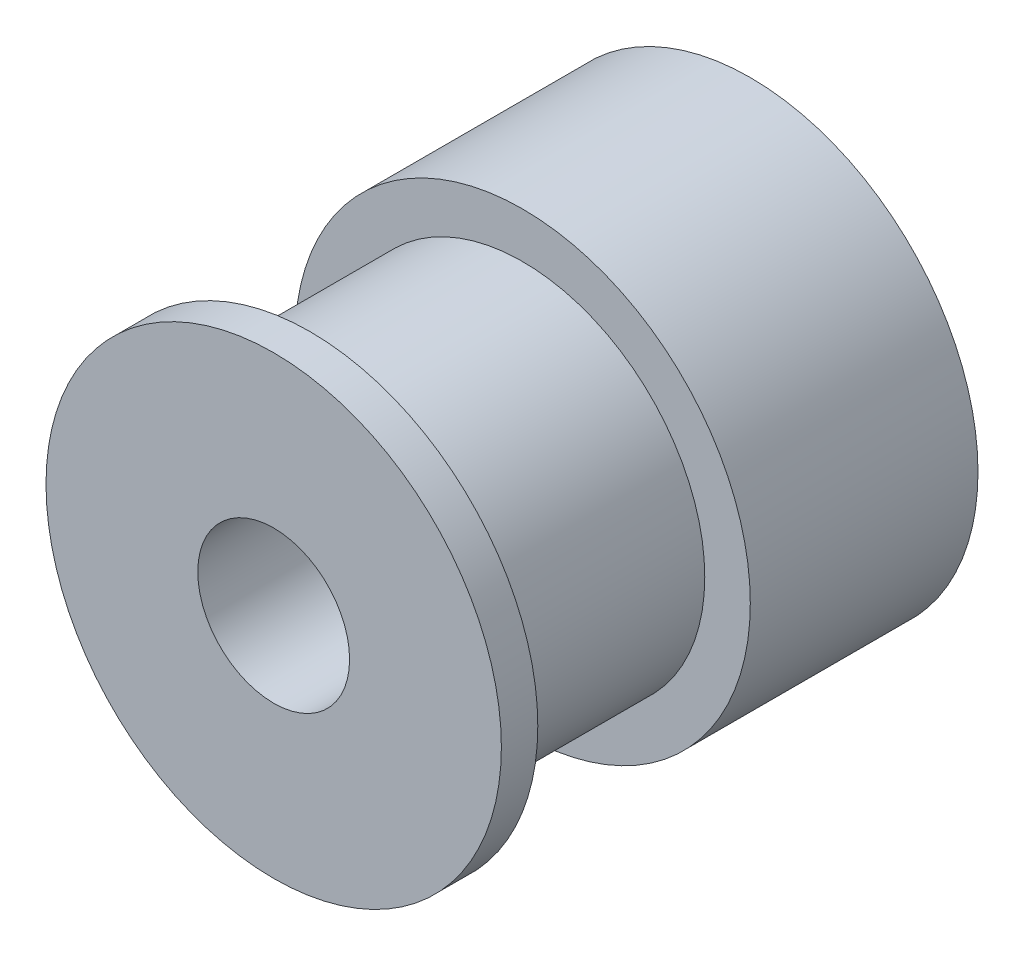
ISO-10303-21;
HEADER;
FILE_DESCRIPTION(('STEP AP214'),'2;1');
FILE_NAME('part.step','',(''),(''),'','','');
FILE_SCHEMA(('AUTOMOTIVE_DESIGN { 1 0 10303 214 1 1 1 1 }'));
ENDSEC;
DATA;
#1=APPLICATION_CONTEXT('core data for automotive mechanical design processes');
#2=APPLICATION_PROTOCOL_DEFINITION('international standard','automotive_design',2000,#1);
#3=PRODUCT_CONTEXT('',#1,'mechanical');
#4=PRODUCT('Part','Part','',(#3));
#5=PRODUCT_RELATED_PRODUCT_CATEGORY('part','',(#4));
#6=PRODUCT_DEFINITION_FORMATION('','',#4);
#7=PRODUCT_DEFINITION_CONTEXT('part definition',#1,'design');
#8=PRODUCT_DEFINITION('design','',#6,#7);
#9=PRODUCT_DEFINITION_SHAPE('','',#8);
#10=(LENGTH_UNIT() NAMED_UNIT(*) SI_UNIT(.MILLI.,.METRE.));
#11=(NAMED_UNIT(*) PLANE_ANGLE_UNIT() SI_UNIT($,.RADIAN.));
#12=(NAMED_UNIT(*) SI_UNIT($,.STERADIAN.) SOLID_ANGLE_UNIT());
#13=UNCERTAINTY_MEASURE_WITH_UNIT(LENGTH_MEASURE(1.E-05),#10,'distance_accuracy_value','');
#14=(GEOMETRIC_REPRESENTATION_CONTEXT(3) GLOBAL_UNCERTAINTY_ASSIGNED_CONTEXT((#13)) GLOBAL_UNIT_ASSIGNED_CONTEXT((#10,
#11,#12)) REPRESENTATION_CONTEXT('',''));
#15=CARTESIAN_POINT('',(0.,0.,0.));
#16=DIRECTION('',(0.,0.,1.));
#17=DIRECTION('',(1.,0.,0.));
#18=AXIS2_PLACEMENT_3D('',#15,#16,#17);
#19=CARTESIAN_POINT('',(0.,0.,7.5));
#20=DIRECTION('',(0.,0.,-1.));
#21=DIRECTION('',(-1.,0.,0.));
#22=AXIS2_PLACEMENT_3D('',#19,#20,#21);
#23=CYLINDRICAL_SURFACE('',#22,7.5);
#24=CARTESIAN_POINT('',(0.,0.,7.5));
#25=DIRECTION('',(0.,0.,1.));
#26=DIRECTION('',(1.,0.,0.));
#27=AXIS2_PLACEMENT_3D('',#24,#25,#26);
#28=CIRCLE('',#27,7.5);
#29=CARTESIAN_POINT('',(7.5,0.,7.5));
#30=VERTEX_POINT('',#29);
#31=EDGE_CURVE('E10',#30,#30,#28,.T.);
#32=ORIENTED_EDGE('',*,*,#31,.F.);
#33=EDGE_LOOP('',(#32));
#34=FACE_BOUND('',#33,.T.);
#35=CARTESIAN_POINT('',(0.,0.,0.));
#36=DIRECTION('',(0.,0.,1.));
#37=DIRECTION('',(1.,0.,0.));
#38=AXIS2_PLACEMENT_3D('',#35,#36,#37);
#39=CIRCLE('',#38,7.5);
#40=CARTESIAN_POINT('',(7.5,0.,0.));
#41=VERTEX_POINT('',#40);
#42=EDGE_CURVE('E38',#41,#41,#39,.T.);
#43=ORIENTED_EDGE('',*,*,#42,.T.);
#44=EDGE_LOOP('',(#43));
#45=FACE_BOUND('',#44,.T.);
#46=ADVANCED_FACE('F31',(#34,#45),#23,.T.);
#47=CARTESIAN_POINT('',(0.,0.,7.5));
#48=DIRECTION('',(0.,0.,1.));
#49=DIRECTION('',(1.,0.,0.));
#50=AXIS2_PLACEMENT_3D('',#47,#48,#49);
#51=PLANE('',#50);
#52=CARTESIAN_POINT('',(0.,0.,7.5));
#53=DIRECTION('',(0.,0.,1.));
#54=DIRECTION('',(1.,0.,0.));
#55=AXIS2_PLACEMENT_3D('',#52,#53,#54);
#56=CIRCLE('',#55,6.);
#57=CARTESIAN_POINT('',(6.,0.,7.5));
#58=VERTEX_POINT('',#57);
#59=EDGE_CURVE('E45',#58,#58,#56,.T.);
#60=ORIENTED_EDGE('',*,*,#59,.F.);
#61=EDGE_LOOP('',(#60));
#62=FACE_BOUND('',#61,.T.);
#63=ORIENTED_EDGE('',*,*,#31,.T.);
#64=EDGE_LOOP('',(#63));
#65=FACE_BOUND('',#64,.T.);
#66=ADVANCED_FACE('F87',(#62,#65),#51,.T.);
#67=CARTESIAN_POINT('',(0.,0.,0.));
#68=DIRECTION('',(0.,0.,1.));
#69=DIRECTION('',(1.,0.,0.));
#70=AXIS2_PLACEMENT_3D('',#67,#68,#69);
#71=PLANE('',#70);
#72=CARTESIAN_POINT('',(0.,0.,0.));
#73=DIRECTION('',(0.,0.,-1.));
#74=DIRECTION('',(-1.,0.,0.));
#75=AXIS2_PLACEMENT_3D('',#72,#73,#74);
#76=CIRCLE('',#75,2.5);
#77=CARTESIAN_POINT('',(-2.5,0.,0.));
#78=VERTEX_POINT('',#77);
#79=EDGE_CURVE('E56',#78,#78,#76,.T.);
#80=ORIENTED_EDGE('',*,*,#79,.F.);
#81=EDGE_LOOP('',(#80));
#82=FACE_BOUND('',#81,.T.);
#83=ORIENTED_EDGE('',*,*,#42,.F.);
#84=EDGE_LOOP('',(#83));
#85=FACE_BOUND('',#84,.T.);
#86=ADVANCED_FACE('F92',(#82,#85),#71,.F.);
#87=CARTESIAN_POINT('',(0.,0.,14.5));
#88=DIRECTION('',(0.,0.,-1.));
#89=DIRECTION('',(-1.,0.,0.));
#90=AXIS2_PLACEMENT_3D('',#87,#88,#89);
#91=CYLINDRICAL_SURFACE('',#90,6.);
#92=CARTESIAN_POINT('',(0.,0.,14.5));
#93=DIRECTION('',(0.,0.,1.));
#94=DIRECTION('',(1.,0.,0.));
#95=AXIS2_PLACEMENT_3D('',#92,#93,#94);
#96=CIRCLE('',#95,6.);
#97=CARTESIAN_POINT('',(6.,0.,14.5));
#98=VERTEX_POINT('',#97);
#99=EDGE_CURVE('E43',#98,#98,#96,.T.);
#100=ORIENTED_EDGE('',*,*,#99,.F.);
#101=EDGE_LOOP('',(#100));
#102=FACE_BOUND('',#101,.T.);
#103=ORIENTED_EDGE('',*,*,#59,.T.);
#104=EDGE_LOOP('',(#103));
#105=FACE_BOUND('',#104,.T.);
#106=ADVANCED_FACE('F75',(#102,#105),#91,.T.);
#107=CARTESIAN_POINT('',(0.,0.,15.7));
#108=DIRECTION('',(0.,0.,-1.));
#109=DIRECTION('',(-1.,0.,0.));
#110=AXIS2_PLACEMENT_3D('',#107,#108,#109);
#111=CYLINDRICAL_SURFACE('',#110,7.5);
#112=CARTESIAN_POINT('',(0.,0.,15.7));
#113=DIRECTION('',(0.,0.,1.));
#114=DIRECTION('',(1.,0.,0.));
#115=AXIS2_PLACEMENT_3D('',#112,#113,#114);
#116=CIRCLE('',#115,7.5);
#117=CARTESIAN_POINT('',(7.5,0.,15.7));
#118=VERTEX_POINT('',#117);
#119=EDGE_CURVE('E48',#118,#118,#116,.T.);
#120=ORIENTED_EDGE('',*,*,#119,.F.);
#121=EDGE_LOOP('',(#120));
#122=FACE_BOUND('',#121,.T.);
#123=CARTESIAN_POINT('',(0.,0.,14.5));
#124=DIRECTION('',(0.,0.,1.));
#125=DIRECTION('',(1.,0.,0.));
#126=AXIS2_PLACEMENT_3D('',#123,#124,#125);
#127=CIRCLE('',#126,7.5);
#128=CARTESIAN_POINT('',(7.5,0.,14.5));
#129=VERTEX_POINT('',#128);
#130=EDGE_CURVE('E51',#129,#129,#127,.T.);
#131=ORIENTED_EDGE('',*,*,#130,.T.);
#132=EDGE_LOOP('',(#131));
#133=FACE_BOUND('',#132,.T.);
#134=ADVANCED_FACE('F69',(#122,#133),#111,.T.);
#135=CARTESIAN_POINT('',(0.,0.,15.7));
#136=DIRECTION('',(0.,0.,1.));
#137=DIRECTION('',(1.,0.,0.));
#138=AXIS2_PLACEMENT_3D('',#135,#136,#137);
#139=PLANE('',#138);
#140=CARTESIAN_POINT('',(0.,0.,15.7));
#141=DIRECTION('',(0.,0.,1.));
#142=DIRECTION('',(1.,0.,0.));
#143=AXIS2_PLACEMENT_3D('',#140,#141,#142);
#144=CIRCLE('',#143,2.5);
#145=CARTESIAN_POINT('',(2.5,0.,15.7));
#146=VERTEX_POINT('',#145);
#147=EDGE_CURVE('E34',#146,#146,#144,.T.);
#148=ORIENTED_EDGE('',*,*,#147,.F.);
#149=EDGE_LOOP('',(#148));
#150=FACE_BOUND('',#149,.T.);
#151=ORIENTED_EDGE('',*,*,#119,.T.);
#152=EDGE_LOOP('',(#151));
#153=FACE_BOUND('',#152,.T.);
#154=ADVANCED_FACE('F65',(#150,#153),#139,.T.);
#155=CARTESIAN_POINT('',(0.,0.,14.5));
#156=DIRECTION('',(0.,0.,1.));
#157=DIRECTION('',(1.,0.,0.));
#158=AXIS2_PLACEMENT_3D('',#155,#156,#157);
#159=PLANE('',#158);
#160=ORIENTED_EDGE('',*,*,#99,.T.);
#161=EDGE_LOOP('',(#160));
#162=FACE_BOUND('',#161,.T.);
#163=ORIENTED_EDGE('',*,*,#130,.F.);
#164=EDGE_LOOP('',(#163));
#165=FACE_BOUND('',#164,.T.);
#166=ADVANCED_FACE('F68',(#162,#165),#159,.F.);
#167=CARTESIAN_POINT('',(0.,0.,30.));
#168=DIRECTION('',(0.,0.,-1.));
#169=DIRECTION('',(-1.,0.,0.));
#170=AXIS2_PLACEMENT_3D('',#167,#168,#169);
#171=CYLINDRICAL_SURFACE('',#170,2.5);
#172=ORIENTED_EDGE('',*,*,#147,.T.);
#173=EDGE_LOOP('',(#172));
#174=FACE_BOUND('',#173,.T.);
#175=ORIENTED_EDGE('',*,*,#79,.T.);
#176=EDGE_LOOP('',(#175));
#177=FACE_BOUND('',#176,.T.);
#178=ADVANCED_FACE('F63',(#174,#177),#171,.F.);
#179=CLOSED_SHELL('',(#46,#66,#86,#106,#134,#154,#166,#178));
#180=MANIFOLD_SOLID_BREP('B2',#179);
#181=ADVANCED_BREP_SHAPE_REPRESENTATION('',(#18,#180),#14);
#182=SHAPE_DEFINITION_REPRESENTATION(#9,#181);
ENDSEC;
END-ISO-10303-21;
